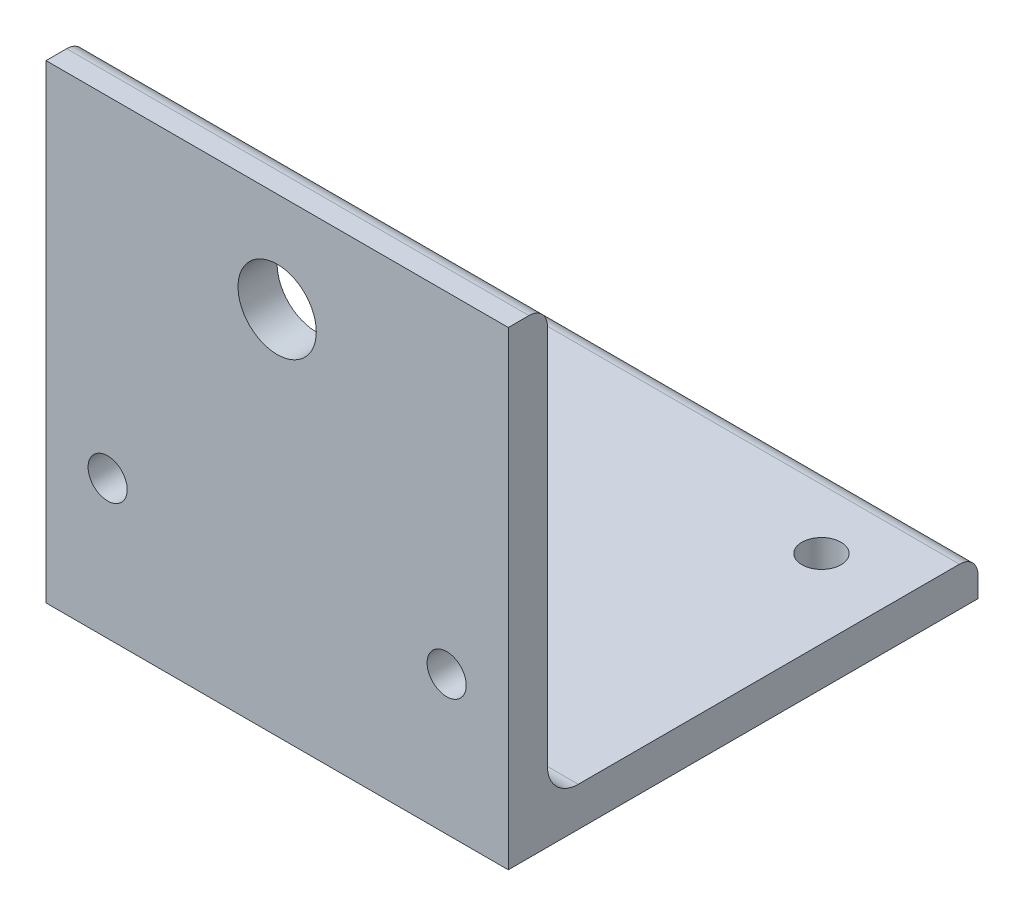
ISO-10303-21;
HEADER;
FILE_DESCRIPTION(('STEP AP214'),'2;1');
FILE_NAME('part.step','',(''),(''),'','','');
FILE_SCHEMA(('AUTOMOTIVE_DESIGN { 1 0 10303 214 1 1 1 1 }'));
ENDSEC;
DATA;
#1=APPLICATION_CONTEXT('core data for automotive mechanical design processes');
#2=APPLICATION_PROTOCOL_DEFINITION('international standard','automotive_design',2000,#1);
#3=PRODUCT_CONTEXT('',#1,'mechanical');
#4=PRODUCT('Part','Part','',(#3));
#5=PRODUCT_RELATED_PRODUCT_CATEGORY('part','',(#4));
#6=PRODUCT_DEFINITION_FORMATION('','',#4);
#7=PRODUCT_DEFINITION_CONTEXT('part definition',#1,'design');
#8=PRODUCT_DEFINITION('design','',#6,#7);
#9=PRODUCT_DEFINITION_SHAPE('','',#8);
#10=(LENGTH_UNIT() NAMED_UNIT(*) SI_UNIT(.MILLI.,.METRE.));
#11=(NAMED_UNIT(*) PLANE_ANGLE_UNIT() SI_UNIT($,.RADIAN.));
#12=(NAMED_UNIT(*) SI_UNIT($,.STERADIAN.) SOLID_ANGLE_UNIT());
#13=UNCERTAINTY_MEASURE_WITH_UNIT(LENGTH_MEASURE(1.E-05),#10,'distance_accuracy_value','');
#14=(GEOMETRIC_REPRESENTATION_CONTEXT(3) GLOBAL_UNCERTAINTY_ASSIGNED_CONTEXT((#13)) GLOBAL_UNIT_ASSIGNED_CONTEXT((#10,
#11,#12)) REPRESENTATION_CONTEXT('',''));
#15=CARTESIAN_POINT('',(0.,0.,0.));
#16=DIRECTION('',(0.,0.,1.));
#17=DIRECTION('',(1.,0.,0.));
#18=AXIS2_PLACEMENT_3D('',#15,#16,#17);
#19=CARTESIAN_POINT('',(75.,0.,-76.2));
#20=DIRECTION('',(0.,1.,0.));
#21=DIRECTION('',(0.,0.,1.));
#22=AXIS2_PLACEMENT_3D('',#19,#20,#21);
#23=PLANE('',#22);
#24=CARTESIAN_POINT('',(62.3,0.,-63.5));
#25=DIRECTION('',(0.,-1.,0.));
#26=DIRECTION('',(0.,0.,-1.));
#27=AXIS2_PLACEMENT_3D('',#24,#25,#26);
#28=CIRCLE('',#27,3.175);
#29=CARTESIAN_POINT('',(62.3,0.,-66.675));
#30=VERTEX_POINT('',#29);
#31=EDGE_CURVE('E174',#30,#30,#28,.T.);
#32=ORIENTED_EDGE('',*,*,#31,.F.);
#33=EDGE_LOOP('',(#32));
#34=FACE_BOUND('',#33,.T.);
#35=CARTESIAN_POINT('',(12.7,0.,-63.5));
#36=DIRECTION('',(0.,-1.,0.));
#37=DIRECTION('',(0.,0.,-1.));
#38=AXIS2_PLACEMENT_3D('',#35,#36,#37);
#39=CIRCLE('',#38,3.175);
#40=CARTESIAN_POINT('',(12.7,0.,-66.675));
#41=VERTEX_POINT('',#40);
#42=EDGE_CURVE('E163',#41,#41,#39,.T.);
#43=ORIENTED_EDGE('',*,*,#42,.F.);
#44=EDGE_LOOP('',(#43));
#45=FACE_BOUND('',#44,.T.);
#46=DIRECTION('',(0.,0.,-1.));
#47=VECTOR('',#46,1.);
#48=CARTESIAN_POINT('',(0.,0.,-76.2));
#49=LINE('',#48,#47);
#50=CARTESIAN_POINT('',(0.,0.,0.));
#51=VERTEX_POINT('',#50);
#52=CARTESIAN_POINT('',(0.,0.,-76.2));
#53=VERTEX_POINT('',#52);
#54=EDGE_CURVE('E129',#51,#53,#49,.T.);
#55=ORIENTED_EDGE('',*,*,#54,.T.);
#56=DIRECTION('',(-1.,0.,0.));
#57=VECTOR('',#56,1.);
#58=CARTESIAN_POINT('',(75.,0.,-76.2));
#59=LINE('',#58,#57);
#60=CARTESIAN_POINT('',(75.,0.,-76.2));
#61=VERTEX_POINT('',#60);
#62=EDGE_CURVE('E110',#61,#53,#59,.T.);
#63=ORIENTED_EDGE('',*,*,#62,.F.);
#64=DIRECTION('',(0.,0.,-1.));
#65=VECTOR('',#64,1.);
#66=CARTESIAN_POINT('',(75.,0.,-76.2));
#67=LINE('',#66,#65);
#68=CARTESIAN_POINT('',(75.,0.,0.));
#69=VERTEX_POINT('',#68);
#70=EDGE_CURVE('E117',#69,#61,#67,.T.);
#71=ORIENTED_EDGE('',*,*,#70,.F.);
#72=DIRECTION('',(-1.,0.,0.));
#73=VECTOR('',#72,1.);
#74=CARTESIAN_POINT('',(75.,0.,0.));
#75=LINE('',#74,#73);
#76=EDGE_CURVE('E137',#69,#51,#75,.T.);
#77=ORIENTED_EDGE('',*,*,#76,.T.);
#78=EDGE_LOOP('',(#55,#63,#71,#77));
#79=FACE_BOUND('',#78,.T.);
#80=ADVANCED_FACE('F32',(#34,#45,#79),#23,.F.);
#81=CARTESIAN_POINT('',(75.,6.35,-76.2));
#82=DIRECTION('',(0.,0.,1.));
#83=DIRECTION('',(1.,0.,0.));
#84=AXIS2_PLACEMENT_3D('',#81,#82,#83);
#85=PLANE('',#84);
#86=DIRECTION('',(0.,1.,0.));
#87=VECTOR('',#86,1.);
#88=CARTESIAN_POINT('',(0.,6.35,-76.2));
#89=LINE('',#88,#87);
#90=CARTESIAN_POINT('',(0.,3.35,-76.2));
#91=VERTEX_POINT('',#90);
#92=EDGE_CURVE('E198',#53,#91,#89,.T.);
#93=ORIENTED_EDGE('',*,*,#92,.T.);
#94=DIRECTION('',(-1.,0.,0.));
#95=VECTOR('',#94,1.);
#96=CARTESIAN_POINT('',(75.,3.35,-76.2));
#97=LINE('',#96,#95);
#98=CARTESIAN_POINT('',(75.,3.35,-76.2));
#99=VERTEX_POINT('',#98);
#100=EDGE_CURVE('E113',#91,#99,#97,.F.);
#101=ORIENTED_EDGE('',*,*,#100,.T.);
#102=DIRECTION('',(0.,1.,0.));
#103=VECTOR('',#102,1.);
#104=CARTESIAN_POINT('',(75.,6.35,-76.2));
#105=LINE('',#104,#103);
#106=EDGE_CURVE('E105',#61,#99,#105,.T.);
#107=ORIENTED_EDGE('',*,*,#106,.F.);
#108=ORIENTED_EDGE('',*,*,#62,.T.);
#109=EDGE_LOOP('',(#93,#101,#107,#108));
#110=FACE_BOUND('',#109,.T.);
#111=ADVANCED_FACE('F108',(#110),#85,.F.);
#112=CARTESIAN_POINT('',(75.,6.34999999999999,-6.35));
#113=DIRECTION('',(0.,-1.,0.));
#114=DIRECTION('',(0.,0.,-1.));
#115=AXIS2_PLACEMENT_3D('',#112,#113,#114);
#116=PLANE('',#115);
#117=CARTESIAN_POINT('',(62.3,6.34999999999999,-63.5));
#118=DIRECTION('',(0.,-1.,0.));
#119=DIRECTION('',(0.,0.,-1.));
#120=AXIS2_PLACEMENT_3D('',#117,#118,#119);
#121=CIRCLE('',#120,3.175);
#122=CARTESIAN_POINT('',(62.3,6.34999999999999,-66.675));
#123=VERTEX_POINT('',#122);
#124=EDGE_CURVE('E36',#123,#123,#121,.T.);
#125=ORIENTED_EDGE('',*,*,#124,.T.);
#126=EDGE_LOOP('',(#125));
#127=FACE_BOUND('',#126,.T.);
#128=CARTESIAN_POINT('',(12.7,6.34999999999999,-63.5));
#129=DIRECTION('',(0.,-1.,0.));
#130=DIRECTION('',(0.,0.,-1.));
#131=AXIS2_PLACEMENT_3D('',#128,#129,#130);
#132=CIRCLE('',#131,3.175);
#133=CARTESIAN_POINT('',(12.7,6.34999999999999,-66.675));
#134=VERTEX_POINT('',#133);
#135=EDGE_CURVE('E160',#134,#134,#132,.T.);
#136=ORIENTED_EDGE('',*,*,#135,.T.);
#137=EDGE_LOOP('',(#136));
#138=FACE_BOUND('',#137,.T.);
#139=DIRECTION('',(0.,0.,1.));
#140=VECTOR('',#139,1.);
#141=CARTESIAN_POINT('',(0.,6.34999999999999,-6.35));
#142=LINE('',#141,#140);
#143=CARTESIAN_POINT('',(0.,6.35,-73.2));
#144=VERTEX_POINT('',#143);
#145=CARTESIAN_POINT('',(0.,6.34999999999999,-11.35));
#146=VERTEX_POINT('',#145);
#147=EDGE_CURVE('E200',#144,#146,#142,.T.);
#148=ORIENTED_EDGE('',*,*,#147,.T.);
#149=DIRECTION('',(-1.,0.,0.));
#150=VECTOR('',#149,1.);
#151=CARTESIAN_POINT('',(75.,6.34999999999999,-11.35));
#152=LINE('',#151,#150);
#153=CARTESIAN_POINT('',(75.,6.34999999999999,-11.35));
#154=VERTEX_POINT('',#153);
#155=EDGE_CURVE('E55',#146,#154,#152,.F.);
#156=ORIENTED_EDGE('',*,*,#155,.T.);
#157=DIRECTION('',(0.,0.,1.));
#158=VECTOR('',#157,1.);
#159=CARTESIAN_POINT('',(75.,6.34999999999999,-6.35));
#160=LINE('',#159,#158);
#161=CARTESIAN_POINT('',(75.,6.35,-73.2));
#162=VERTEX_POINT('',#161);
#163=EDGE_CURVE('E116',#162,#154,#160,.T.);
#164=ORIENTED_EDGE('',*,*,#163,.F.);
#165=DIRECTION('',(-1.,0.,0.));
#166=VECTOR('',#165,1.);
#167=CARTESIAN_POINT('',(75.,6.35,-73.2));
#168=LINE('',#167,#166);
#169=EDGE_CURVE('E130',#162,#144,#168,.T.);
#170=ORIENTED_EDGE('',*,*,#169,.T.);
#171=EDGE_LOOP('',(#148,#156,#164,#170));
#172=FACE_BOUND('',#171,.T.);
#173=ADVANCED_FACE('F214',(#127,#138,#172),#116,.F.);
#174=CARTESIAN_POINT('',(75.,76.2,-6.35));
#175=DIRECTION('',(0.,0.,1.));
#176=DIRECTION('',(0.,-1.,0.));
#177=AXIS2_PLACEMENT_3D('',#174,#175,#176);
#178=PLANE('',#177);
#179=CARTESIAN_POINT('',(65.,22.5,-6.35000000000001));
#180=DIRECTION('',(0.,0.,1.));
#181=DIRECTION('',(0.,-1.,0.));
#182=AXIS2_PLACEMENT_3D('',#179,#180,#181);
#183=CIRCLE('',#182,3.175);
#184=CARTESIAN_POINT('',(68.175,22.5,-6.35000000000002));
#185=VERTEX_POINT('',#184);
#186=EDGE_CURVE('E167',#185,#185,#183,.T.);
#187=ORIENTED_EDGE('',*,*,#186,.T.);
#188=EDGE_LOOP('',(#187));
#189=FACE_BOUND('',#188,.T.);
#190=CARTESIAN_POINT('',(9.99999999999999,22.5,-6.35000000000001));
#191=DIRECTION('',(0.,0.,1.));
#192=DIRECTION('',(0.,-1.,0.));
#193=AXIS2_PLACEMENT_3D('',#190,#191,#192);
#194=CIRCLE('',#193,3.175);
#195=CARTESIAN_POINT('',(13.175,22.5,-6.35000000000002));
#196=VERTEX_POINT('',#195);
#197=EDGE_CURVE('E182',#196,#196,#194,.T.);
#198=ORIENTED_EDGE('',*,*,#197,.T.);
#199=EDGE_LOOP('',(#198));
#200=FACE_BOUND('',#199,.T.);
#201=CARTESIAN_POINT('',(37.5,60.,-6.35000000000001));
#202=DIRECTION('',(0.,0.,1.));
#203=DIRECTION('',(0.,-1.,0.));
#204=AXIS2_PLACEMENT_3D('',#201,#202,#203);
#205=CIRCLE('',#204,6.35);
#206=CARTESIAN_POINT('',(43.85,60.,-6.35000000000002));
#207=VERTEX_POINT('',#206);
#208=EDGE_CURVE('E188',#207,#207,#205,.F.);
#209=ORIENTED_EDGE('',*,*,#208,.F.);
#210=EDGE_LOOP('',(#209));
#211=FACE_BOUND('',#210,.T.);
#212=DIRECTION('',(0.,1.,0.));
#213=VECTOR('',#212,1.);
#214=CARTESIAN_POINT('',(75.,76.2,-6.35));
#215=LINE('',#214,#213);
#216=CARTESIAN_POINT('',(75.,11.35,-6.35));
#217=VERTEX_POINT('',#216);
#218=CARTESIAN_POINT('',(75.,73.2,-6.35));
#219=VERTEX_POINT('',#218);
#220=EDGE_CURVE('E192',#217,#219,#215,.T.);
#221=ORIENTED_EDGE('',*,*,#220,.F.);
#222=DIRECTION('',(-1.,0.,0.));
#223=VECTOR('',#222,1.);
#224=CARTESIAN_POINT('',(0.,11.35,-6.35));
#225=LINE('',#224,#223);
#226=CARTESIAN_POINT('',(0.,11.35,-6.35));
#227=VERTEX_POINT('',#226);
#228=EDGE_CURVE('E156',#217,#227,#225,.T.);
#229=ORIENTED_EDGE('',*,*,#228,.T.);
#230=DIRECTION('',(0.,1.,0.));
#231=VECTOR('',#230,1.);
#232=CARTESIAN_POINT('',(0.,76.2,-6.35));
#233=LINE('',#232,#231);
#234=CARTESIAN_POINT('',(0.,73.2,-6.35));
#235=VERTEX_POINT('',#234);
#236=EDGE_CURVE('E202',#227,#235,#233,.T.);
#237=ORIENTED_EDGE('',*,*,#236,.T.);
#238=DIRECTION('',(-1.,0.,0.));
#239=VECTOR('',#238,1.);
#240=CARTESIAN_POINT('',(75.,73.2,-6.35));
#241=LINE('',#240,#239);
#242=EDGE_CURVE('E153',#235,#219,#241,.F.);
#243=ORIENTED_EDGE('',*,*,#242,.T.);
#244=EDGE_LOOP('',(#221,#229,#237,#243));
#245=FACE_BOUND('',#244,.T.);
#246=ADVANCED_FACE('F219',(#189,#200,#211,#245),#178,.F.);
#247=CARTESIAN_POINT('',(75.,76.2,0.));
#248=DIRECTION('',(0.,-1.,0.));
#249=DIRECTION('',(0.,0.,-1.));
#250=AXIS2_PLACEMENT_3D('',#247,#248,#249);
#251=PLANE('',#250);
#252=DIRECTION('',(0.,0.,1.));
#253=VECTOR('',#252,1.);
#254=CARTESIAN_POINT('',(75.,76.2,0.));
#255=LINE('',#254,#253);
#256=CARTESIAN_POINT('',(75.,76.2,-3.35));
#257=VERTEX_POINT('',#256);
#258=CARTESIAN_POINT('',(75.,76.2,0.));
#259=VERTEX_POINT('',#258);
#260=EDGE_CURVE('E194',#257,#259,#255,.T.);
#261=ORIENTED_EDGE('',*,*,#260,.F.);
#262=DIRECTION('',(-1.,0.,0.));
#263=VECTOR('',#262,1.);
#264=CARTESIAN_POINT('',(75.,76.2,-3.35));
#265=LINE('',#264,#263);
#266=CARTESIAN_POINT('',(0.,76.2,-3.35));
#267=VERTEX_POINT('',#266);
#268=EDGE_CURVE('E150',#257,#267,#265,.T.);
#269=ORIENTED_EDGE('',*,*,#268,.T.);
#270=DIRECTION('',(0.,0.,1.));
#271=VECTOR('',#270,1.);
#272=CARTESIAN_POINT('',(0.,76.2,0.));
#273=LINE('',#272,#271);
#274=CARTESIAN_POINT('',(0.,76.2,0.));
#275=VERTEX_POINT('',#274);
#276=EDGE_CURVE('E204',#267,#275,#273,.T.);
#277=ORIENTED_EDGE('',*,*,#276,.T.);
#278=DIRECTION('',(-1.,0.,0.));
#279=VECTOR('',#278,1.);
#280=CARTESIAN_POINT('',(75.,76.2,0.));
#281=LINE('',#280,#279);
#282=EDGE_CURVE('E131',#259,#275,#281,.T.);
#283=ORIENTED_EDGE('',*,*,#282,.F.);
#284=EDGE_LOOP('',(#261,#269,#277,#283));
#285=FACE_BOUND('',#284,.T.);
#286=ADVANCED_FACE('F228',(#285),#251,.F.);
#287=CARTESIAN_POINT('',(75.,0.,0.));
#288=DIRECTION('',(0.,0.,-1.));
#289=DIRECTION('',(-1.,0.,0.));
#290=AXIS2_PLACEMENT_3D('',#287,#288,#289);
#291=PLANE('',#290);
#292=CARTESIAN_POINT('',(65.,22.5,0.));
#293=DIRECTION('',(0.,0.,1.));
#294=DIRECTION('',(1.,0.,0.));
#295=AXIS2_PLACEMENT_3D('',#292,#293,#294);
#296=CIRCLE('',#295,3.175);
#297=CARTESIAN_POINT('',(68.175,22.5,0.));
#298=VERTEX_POINT('',#297);
#299=EDGE_CURVE('E162',#298,#298,#296,.T.);
#300=ORIENTED_EDGE('',*,*,#299,.F.);
#301=EDGE_LOOP('',(#300));
#302=FACE_BOUND('',#301,.T.);
#303=CARTESIAN_POINT('',(9.99999999999999,22.5,0.));
#304=DIRECTION('',(0.,0.,1.));
#305=DIRECTION('',(1.,0.,0.));
#306=AXIS2_PLACEMENT_3D('',#303,#304,#305);
#307=CIRCLE('',#306,3.175);
#308=CARTESIAN_POINT('',(13.175,22.5,0.));
#309=VERTEX_POINT('',#308);
#310=EDGE_CURVE('E179',#309,#309,#307,.T.);
#311=ORIENTED_EDGE('',*,*,#310,.F.);
#312=EDGE_LOOP('',(#311));
#313=FACE_BOUND('',#312,.T.);
#314=CARTESIAN_POINT('',(37.5,60.,0.));
#315=DIRECTION('',(0.,0.,-1.));
#316=DIRECTION('',(-1.,0.,0.));
#317=AXIS2_PLACEMENT_3D('',#314,#315,#316);
#318=CIRCLE('',#317,6.35);
#319=CARTESIAN_POINT('',(43.85,60.,0.));
#320=VERTEX_POINT('',#319);
#321=EDGE_CURVE('E185',#320,#320,#318,.T.);
#322=ORIENTED_EDGE('',*,*,#321,.T.);
#323=EDGE_LOOP('',(#322));
#324=FACE_BOUND('',#323,.T.);
#325=DIRECTION('',(0.,-1.,0.));
#326=VECTOR('',#325,1.);
#327=CARTESIAN_POINT('',(0.,0.,0.));
#328=LINE('',#327,#326);
#329=EDGE_CURVE('E126',#275,#51,#328,.T.);
#330=ORIENTED_EDGE('',*,*,#329,.T.);
#331=ORIENTED_EDGE('',*,*,#76,.F.);
#332=DIRECTION('',(0.,-1.,0.));
#333=VECTOR('',#332,1.);
#334=CARTESIAN_POINT('',(75.,0.,0.));
#335=LINE('',#334,#333);
#336=EDGE_CURVE('E122',#259,#69,#335,.T.);
#337=ORIENTED_EDGE('',*,*,#336,.F.);
#338=ORIENTED_EDGE('',*,*,#282,.T.);
#339=EDGE_LOOP('',(#330,#331,#337,#338));
#340=FACE_BOUND('',#339,.T.);
#341=ADVANCED_FACE('F229',(#302,#313,#324,#340),#291,.F.);
#342=CARTESIAN_POINT('',(75.,0.,0.));
#343=DIRECTION('',(-1.,0.,0.));
#344=DIRECTION('',(0.,0.,1.));
#345=AXIS2_PLACEMENT_3D('',#342,#343,#344);
#346=PLANE('',#345);
#347=ORIENTED_EDGE('',*,*,#106,.T.);
#348=CARTESIAN_POINT('',(75.,3.35,-73.2));
#349=DIRECTION('',(-1.,0.,0.));
#350=DIRECTION('',(0.,0.,1.));
#351=AXIS2_PLACEMENT_3D('',#348,#349,#350);
#352=CIRCLE('',#351,3.);
#353=EDGE_CURVE('E148',#99,#162,#352,.F.);
#354=ORIENTED_EDGE('',*,*,#353,.T.);
#355=ORIENTED_EDGE('',*,*,#163,.T.);
#356=CARTESIAN_POINT('',(75.,11.35,-11.35));
#357=DIRECTION('',(-1.,0.,0.));
#358=DIRECTION('',(0.,0.,1.));
#359=AXIS2_PLACEMENT_3D('',#356,#357,#358);
#360=CIRCLE('',#359,5.);
#361=EDGE_CURVE('E11',#154,#217,#360,.T.);
#362=ORIENTED_EDGE('',*,*,#361,.T.);
#363=ORIENTED_EDGE('',*,*,#220,.T.);
#364=CARTESIAN_POINT('',(75.,73.2,-3.35));
#365=DIRECTION('',(-1.,0.,0.));
#366=DIRECTION('',(0.,0.,1.));
#367=AXIS2_PLACEMENT_3D('',#364,#365,#366);
#368=CIRCLE('',#367,3.);
#369=EDGE_CURVE('E146',#219,#257,#368,.F.);
#370=ORIENTED_EDGE('',*,*,#369,.T.);
#371=ORIENTED_EDGE('',*,*,#260,.T.);
#372=ORIENTED_EDGE('',*,*,#336,.T.);
#373=ORIENTED_EDGE('',*,*,#70,.T.);
#374=EDGE_LOOP('',(#347,#354,#355,#362,#363,#370,#371,#372,#373));
#375=FACE_BOUND('',#374,.T.);
#376=ADVANCED_FACE('F120',(#375),#346,.F.);
#377=CARTESIAN_POINT('',(0.,0.,0.));
#378=DIRECTION('',(-1.,0.,0.));
#379=DIRECTION('',(0.,0.,1.));
#380=AXIS2_PLACEMENT_3D('',#377,#378,#379);
#381=PLANE('',#380);
#382=ORIENTED_EDGE('',*,*,#147,.F.);
#383=CARTESIAN_POINT('',(0.,3.35,-73.2));
#384=DIRECTION('',(-1.,0.,0.));
#385=DIRECTION('',(0.,0.,1.));
#386=AXIS2_PLACEMENT_3D('',#383,#384,#385);
#387=CIRCLE('',#386,3.);
#388=EDGE_CURVE('E143',#144,#91,#387,.T.);
#389=ORIENTED_EDGE('',*,*,#388,.T.);
#390=ORIENTED_EDGE('',*,*,#92,.F.);
#391=ORIENTED_EDGE('',*,*,#54,.F.);
#392=ORIENTED_EDGE('',*,*,#329,.F.);
#393=ORIENTED_EDGE('',*,*,#276,.F.);
#394=CARTESIAN_POINT('',(0.,73.2,-3.35));
#395=DIRECTION('',(-1.,0.,0.));
#396=DIRECTION('',(0.,0.,1.));
#397=AXIS2_PLACEMENT_3D('',#394,#395,#396);
#398=CIRCLE('',#397,3.);
#399=EDGE_CURVE('E134',#267,#235,#398,.T.);
#400=ORIENTED_EDGE('',*,*,#399,.T.);
#401=ORIENTED_EDGE('',*,*,#236,.F.);
#402=CARTESIAN_POINT('',(0.,11.35,-11.35));
#403=DIRECTION('',(-1.,0.,0.));
#404=DIRECTION('',(0.,0.,1.));
#405=AXIS2_PLACEMENT_3D('',#402,#403,#404);
#406=CIRCLE('',#405,5.);
#407=EDGE_CURVE('E41',#227,#146,#406,.F.);
#408=ORIENTED_EDGE('',*,*,#407,.T.);
#409=EDGE_LOOP('',(#382,#389,#390,#391,#392,#393,#400,#401,#408));
#410=FACE_BOUND('',#409,.T.);
#411=ADVANCED_FACE('F208',(#410),#381,.T.);
#412=CARTESIAN_POINT('',(75.,3.35,-73.2));
#413=DIRECTION('',(-1.,0.,0.));
#414=DIRECTION('',(0.,0.,1.));
#415=AXIS2_PLACEMENT_3D('',#412,#413,#414);
#416=CYLINDRICAL_SURFACE('',#415,3.);
#417=ORIENTED_EDGE('',*,*,#353,.F.);
#418=ORIENTED_EDGE('',*,*,#100,.F.);
#419=ORIENTED_EDGE('',*,*,#388,.F.);
#420=ORIENTED_EDGE('',*,*,#169,.F.);
#421=EDGE_LOOP('',(#417,#418,#419,#420));
#422=FACE_BOUND('',#421,.T.);
#423=ADVANCED_FACE('F211',(#422),#416,.T.);
#424=CARTESIAN_POINT('',(75.,73.2,-3.35));
#425=DIRECTION('',(-1.,0.,0.));
#426=DIRECTION('',(0.,0.,1.));
#427=AXIS2_PLACEMENT_3D('',#424,#425,#426);
#428=CYLINDRICAL_SURFACE('',#427,3.);
#429=ORIENTED_EDGE('',*,*,#369,.F.);
#430=ORIENTED_EDGE('',*,*,#242,.F.);
#431=ORIENTED_EDGE('',*,*,#399,.F.);
#432=ORIENTED_EDGE('',*,*,#268,.F.);
#433=EDGE_LOOP('',(#429,#430,#431,#432));
#434=FACE_BOUND('',#433,.T.);
#435=ADVANCED_FACE('F224',(#434),#428,.T.);
#436=CARTESIAN_POINT('',(75.,11.35,-11.35));
#437=DIRECTION('',(1.,0.,0.));
#438=DIRECTION('',(0.,0.,-1.));
#439=AXIS2_PLACEMENT_3D('',#436,#437,#438);
#440=CYLINDRICAL_SURFACE('',#439,5.);
#441=ORIENTED_EDGE('',*,*,#361,.F.);
#442=ORIENTED_EDGE('',*,*,#155,.F.);
#443=ORIENTED_EDGE('',*,*,#407,.F.);
#444=ORIENTED_EDGE('',*,*,#228,.F.);
#445=EDGE_LOOP('',(#441,#442,#443,#444));
#446=FACE_BOUND('',#445,.T.);
#447=ADVANCED_FACE('F34',(#446),#440,.F.);
#448=CARTESIAN_POINT('',(37.5,60.,-76.2));
#449=DIRECTION('',(0.,0.,1.));
#450=DIRECTION('',(1.,0.,0.));
#451=AXIS2_PLACEMENT_3D('',#448,#449,#450);
#452=CYLINDRICAL_SURFACE('',#451,6.35);
#453=CARTESIAN_POINT('',(43.85,60.,0.));
#454=CARTESIAN_POINT('',(43.85,60.,-0.0661458333333318));
#455=CARTESIAN_POINT('',(43.85,60.,-0.132291666666664));
#456=CARTESIAN_POINT('',(43.85,60.,-0.264583333333332));
#457=CARTESIAN_POINT('',(43.85,60.,-0.330729166666668));
#458=CARTESIAN_POINT('',(43.85,60.,-0.463020833333337));
#459=CARTESIAN_POINT('',(43.85,60.,-0.529166666666669));
#460=CARTESIAN_POINT('',(43.85,60.,-0.661458333333337));
#461=CARTESIAN_POINT('',(43.85,60.,-0.727604166666673));
#462=CARTESIAN_POINT('',(43.85,60.,-0.859895833333342));
#463=CARTESIAN_POINT('',(43.85,60.,-0.926041666666673));
#464=CARTESIAN_POINT('',(43.85,60.,-1.05833333333334));
#465=CARTESIAN_POINT('',(43.85,60.,-1.12447916666667));
#466=CARTESIAN_POINT('',(43.85,60.,-1.25677083333334));
#467=CARTESIAN_POINT('',(43.85,60.,-1.32291666666667));
#468=CARTESIAN_POINT('',(43.85,60.,-1.45520833333334));
#469=CARTESIAN_POINT('',(43.85,60.,-1.52135416666667));
#470=CARTESIAN_POINT('',(43.85,60.,-1.65364583333334));
#471=CARTESIAN_POINT('',(43.85,60.,-1.71979166666667));
#472=CARTESIAN_POINT('',(43.85,60.,-1.85208333333334));
#473=CARTESIAN_POINT('',(43.85,60.,-1.91822916666667));
#474=CARTESIAN_POINT('',(43.85,60.,-2.05052083333334));
#475=CARTESIAN_POINT('',(43.85,60.,-2.11666666666667));
#476=CARTESIAN_POINT('',(43.85,60.,-2.24895833333334));
#477=CARTESIAN_POINT('',(43.85,60.,-2.31510416666667));
#478=CARTESIAN_POINT('',(43.85,60.,-2.44739583333334));
#479=CARTESIAN_POINT('',(43.85,60.,-2.51354166666667));
#480=CARTESIAN_POINT('',(43.85,60.,-2.64583333333334));
#481=CARTESIAN_POINT('',(43.85,60.,-2.71197916666667));
#482=CARTESIAN_POINT('',(43.85,60.,-2.84427083333334));
#483=CARTESIAN_POINT('',(43.85,60.,-2.91041666666668));
#484=CARTESIAN_POINT('',(43.85,60.,-3.04270833333335));
#485=CARTESIAN_POINT('',(43.85,60.,-3.10885416666668));
#486=CARTESIAN_POINT('',(43.85,60.,-3.24114583333334));
#487=CARTESIAN_POINT('',(43.85,60.,-3.30729166666667));
#488=CARTESIAN_POINT('',(43.85,60.,-3.43958333333334));
#489=CARTESIAN_POINT('',(43.85,60.,-3.50572916666668));
#490=CARTESIAN_POINT('',(43.85,60.,-3.63802083333335));
#491=CARTESIAN_POINT('',(43.85,60.,-3.70416666666668));
#492=CARTESIAN_POINT('',(43.85,60.,-3.83645833333335));
#493=CARTESIAN_POINT('',(43.85,60.,-3.90260416666668));
#494=CARTESIAN_POINT('',(43.85,60.,-4.03489583333335));
#495=CARTESIAN_POINT('',(43.85,60.,-4.10104166666668));
#496=CARTESIAN_POINT('',(43.85,60.,-4.23333333333335));
#497=CARTESIAN_POINT('',(43.85,60.,-4.29947916666668));
#498=CARTESIAN_POINT('',(43.85,60.,-4.43177083333335));
#499=CARTESIAN_POINT('',(43.85,60.,-4.49791666666668));
#500=CARTESIAN_POINT('',(43.85,60.,-4.63020833333335));
#501=CARTESIAN_POINT('',(43.85,60.,-4.69635416666668));
#502=CARTESIAN_POINT('',(43.85,60.,-4.82864583333335));
#503=CARTESIAN_POINT('',(43.85,60.,-4.89479166666668));
#504=CARTESIAN_POINT('',(43.85,60.,-5.02708333333335));
#505=CARTESIAN_POINT('',(43.85,60.,-5.09322916666668));
#506=CARTESIAN_POINT('',(43.85,60.,-5.22552083333335));
#507=CARTESIAN_POINT('',(43.85,60.,-5.29166666666668));
#508=CARTESIAN_POINT('',(43.85,60.,-5.42395833333335));
#509=CARTESIAN_POINT('',(43.85,60.,-5.49010416666668));
#510=CARTESIAN_POINT('',(43.85,60.,-5.62239583333335));
#511=CARTESIAN_POINT('',(43.85,60.,-5.68854166666669));
#512=CARTESIAN_POINT('',(43.85,60.,-5.82083333333335));
#513=CARTESIAN_POINT('',(43.85,60.,-5.88697916666669));
#514=CARTESIAN_POINT('',(43.85,60.,-6.01927083333335));
#515=CARTESIAN_POINT('',(43.85,60.,-6.08541666666669));
#516=CARTESIAN_POINT('',(43.85,60.,-6.21770833333336));
#517=CARTESIAN_POINT('',(43.85,60.,-6.28385416666669));
#518=CARTESIAN_POINT('',(43.85,60.,-6.35000000000002));
#519=B_SPLINE_CURVE_WITH_KNOTS('',3,(#453,#454,#455,#456,#457,#458,#459,#460,#461,#462,#463,
#464,#465,#466,#467,#468,#469,#470,#471,#472,#473,#474,#475,#476,#477,#478,#479,#480,#481,#482,
#483,#484,#485,#486,#487,#488,#489,#490,#491,#492,#493,#494,#495,#496,#497,#498,#499,#500,#501,
#502,#503,#504,#505,#506,#507,#508,#509,#510,#511,#512,#513,#514,#515,#516,#517,#518),
.UNSPECIFIED.,.F.,.F.,(4,2,2,2,2,2,2,2,2,2,2,2,2,2,2,2,2,2,2,2,2,2,2,2,2,2,2,2,2,2,2,2,4),(0.,
0.198437499999995,0.396875000000005,0.5953125,0.79375000000001,0.992187500000005,1.190625,
1.38906250000001,1.58750000000001,1.7859375,1.98437500000001,2.18281250000001,2.38125,
2.57968750000001,2.77812500000001,2.97656250000002,3.17500000000001,3.37343750000001,
3.57187500000002,3.77031250000001,3.96875000000002,4.16718750000002,4.36562500000001,
4.56406250000002,4.76250000000002,4.96093750000001,5.15937500000002,5.35781250000002,
5.55625000000001,5.75468750000002,5.95312500000002,6.15156250000003,6.35000000000002),.UNSPECIFIED.);
#520=EDGE_CURVE('BSEAM258',#320,#207,#519,.T.);
#521=ORIENTED_EDGE('',*,*,#321,.F.);
#522=ORIENTED_EDGE('',*,*,#208,.T.);
#523=ORIENTED_EDGE('',*,*,#520,.T.);
#524=ORIENTED_EDGE('',*,*,#520,.F.);
#525=EDGE_LOOP('',(#521,#523,#522,#524));
#526=FACE_BOUND('',#525,.T.);
#527=ADVANCED_FACE('F258',(#526),#452,.F.);
#528=CARTESIAN_POINT('',(9.99999999999999,22.5,-76.2));
#529=DIRECTION('',(0.,0.,1.));
#530=DIRECTION('',(1.,0.,0.));
#531=AXIS2_PLACEMENT_3D('',#528,#529,#530);
#532=CYLINDRICAL_SURFACE('',#531,3.175);
#533=CARTESIAN_POINT('',(13.175,22.5,0.));
#534=CARTESIAN_POINT('',(13.175,22.5,-0.0661458333333318));
#535=CARTESIAN_POINT('',(13.175,22.5,-0.132291666666664));
#536=CARTESIAN_POINT('',(13.175,22.5,-0.264583333333332));
#537=CARTESIAN_POINT('',(13.175,22.5,-0.330729166666668));
#538=CARTESIAN_POINT('',(13.175,22.5,-0.463020833333337));
#539=CARTESIAN_POINT('',(13.175,22.5,-0.529166666666669));
#540=CARTESIAN_POINT('',(13.175,22.5,-0.661458333333337));
#541=CARTESIAN_POINT('',(13.175,22.5,-0.727604166666673));
#542=CARTESIAN_POINT('',(13.175,22.5,-0.859895833333342));
#543=CARTESIAN_POINT('',(13.175,22.5,-0.926041666666673));
#544=CARTESIAN_POINT('',(13.175,22.5,-1.05833333333334));
#545=CARTESIAN_POINT('',(13.175,22.5,-1.12447916666667));
#546=CARTESIAN_POINT('',(13.175,22.5,-1.25677083333334));
#547=CARTESIAN_POINT('',(13.175,22.5,-1.32291666666667));
#548=CARTESIAN_POINT('',(13.175,22.5,-1.45520833333334));
#549=CARTESIAN_POINT('',(13.175,22.5,-1.52135416666667));
#550=CARTESIAN_POINT('',(13.175,22.5,-1.65364583333334));
#551=CARTESIAN_POINT('',(13.175,22.5,-1.71979166666667));
#552=CARTESIAN_POINT('',(13.175,22.5,-1.85208333333334));
#553=CARTESIAN_POINT('',(13.175,22.5,-1.91822916666667));
#554=CARTESIAN_POINT('',(13.175,22.5,-2.05052083333334));
#555=CARTESIAN_POINT('',(13.175,22.5,-2.11666666666667));
#556=CARTESIAN_POINT('',(13.175,22.5,-2.24895833333334));
#557=CARTESIAN_POINT('',(13.175,22.5,-2.31510416666667));
#558=CARTESIAN_POINT('',(13.175,22.5,-2.44739583333334));
#559=CARTESIAN_POINT('',(13.175,22.5,-2.51354166666667));
#560=CARTESIAN_POINT('',(13.175,22.5,-2.64583333333334));
#561=CARTESIAN_POINT('',(13.175,22.5,-2.71197916666667));
#562=CARTESIAN_POINT('',(13.175,22.5,-2.84427083333334));
#563=CARTESIAN_POINT('',(13.175,22.5,-2.91041666666668));
#564=CARTESIAN_POINT('',(13.175,22.5,-3.04270833333335));
#565=CARTESIAN_POINT('',(13.175,22.5,-3.10885416666668));
#566=CARTESIAN_POINT('',(13.175,22.5,-3.24114583333334));
#567=CARTESIAN_POINT('',(13.175,22.5,-3.30729166666667));
#568=CARTESIAN_POINT('',(13.175,22.5,-3.43958333333334));
#569=CARTESIAN_POINT('',(13.175,22.5,-3.50572916666668));
#570=CARTESIAN_POINT('',(13.175,22.5,-3.63802083333335));
#571=CARTESIAN_POINT('',(13.175,22.5,-3.70416666666668));
#572=CARTESIAN_POINT('',(13.175,22.5,-3.83645833333335));
#573=CARTESIAN_POINT('',(13.175,22.5,-3.90260416666668));
#574=CARTESIAN_POINT('',(13.175,22.5,-4.03489583333335));
#575=CARTESIAN_POINT('',(13.175,22.5,-4.10104166666668));
#576=CARTESIAN_POINT('',(13.175,22.5,-4.23333333333335));
#577=CARTESIAN_POINT('',(13.175,22.5,-4.29947916666668));
#578=CARTESIAN_POINT('',(13.175,22.5,-4.43177083333335));
#579=CARTESIAN_POINT('',(13.175,22.5,-4.49791666666668));
#580=CARTESIAN_POINT('',(13.175,22.5,-4.63020833333335));
#581=CARTESIAN_POINT('',(13.175,22.5,-4.69635416666668));
#582=CARTESIAN_POINT('',(13.175,22.5,-4.82864583333335));
#583=CARTESIAN_POINT('',(13.175,22.5,-4.89479166666668));
#584=CARTESIAN_POINT('',(13.175,22.5,-5.02708333333335));
#585=CARTESIAN_POINT('',(13.175,22.5,-5.09322916666668));
#586=CARTESIAN_POINT('',(13.175,22.5,-5.22552083333335));
#587=CARTESIAN_POINT('',(13.175,22.5,-5.29166666666668));
#588=CARTESIAN_POINT('',(13.175,22.5,-5.42395833333335));
#589=CARTESIAN_POINT('',(13.175,22.5,-5.49010416666668));
#590=CARTESIAN_POINT('',(13.175,22.5,-5.62239583333335));
#591=CARTESIAN_POINT('',(13.175,22.5,-5.68854166666669));
#592=CARTESIAN_POINT('',(13.175,22.5,-5.82083333333335));
#593=CARTESIAN_POINT('',(13.175,22.5,-5.88697916666669));
#594=CARTESIAN_POINT('',(13.175,22.5,-6.01927083333335));
#595=CARTESIAN_POINT('',(13.175,22.5,-6.08541666666669));
#596=CARTESIAN_POINT('',(13.175,22.5,-6.21770833333336));
#597=CARTESIAN_POINT('',(13.175,22.5,-6.28385416666669));
#598=CARTESIAN_POINT('',(13.175,22.5,-6.35000000000002));
#599=B_SPLINE_CURVE_WITH_KNOTS('',3,(#533,#534,#535,#536,#537,#538,#539,#540,#541,#542,#543,
#544,#545,#546,#547,#548,#549,#550,#551,#552,#553,#554,#555,#556,#557,#558,#559,#560,#561,#562,
#563,#564,#565,#566,#567,#568,#569,#570,#571,#572,#573,#574,#575,#576,#577,#578,#579,#580,#581,
#582,#583,#584,#585,#586,#587,#588,#589,#590,#591,#592,#593,#594,#595,#596,#597,#598),
.UNSPECIFIED.,.F.,.F.,(4,2,2,2,2,2,2,2,2,2,2,2,2,2,2,2,2,2,2,2,2,2,2,2,2,2,2,2,2,2,2,2,4),(0.,
0.198437499999995,0.396875000000005,0.5953125,0.79375000000001,0.992187500000005,1.190625,
1.38906250000001,1.58750000000001,1.7859375,1.98437500000001,2.18281250000001,2.38125,
2.57968750000001,2.77812500000001,2.97656250000002,3.17500000000001,3.37343750000001,
3.57187500000002,3.77031250000001,3.96875000000002,4.16718750000002,4.36562500000001,
4.56406250000002,4.76250000000002,4.96093750000001,5.15937500000002,5.35781250000002,
5.55625000000001,5.75468750000002,5.95312500000002,6.15156250000003,6.35000000000002),.UNSPECIFIED.);
#600=EDGE_CURVE('BSEAM262',#309,#196,#599,.T.);
#601=ORIENTED_EDGE('',*,*,#310,.T.);
#602=ORIENTED_EDGE('',*,*,#197,.F.);
#603=ORIENTED_EDGE('',*,*,#600,.T.);
#604=ORIENTED_EDGE('',*,*,#600,.F.);
#605=EDGE_LOOP('',(#601,#603,#602,#604));
#606=FACE_BOUND('',#605,.T.);
#607=ADVANCED_FACE('F262',(#606),#532,.F.);
#608=CARTESIAN_POINT('',(65.,22.5,-76.2));
#609=DIRECTION('',(0.,0.,1.));
#610=DIRECTION('',(1.,0.,0.));
#611=AXIS2_PLACEMENT_3D('',#608,#609,#610);
#612=CYLINDRICAL_SURFACE('',#611,3.175);
#613=CARTESIAN_POINT('',(68.175,22.5,0.));
#614=CARTESIAN_POINT('',(68.175,22.5,-0.0661458333333318));
#615=CARTESIAN_POINT('',(68.175,22.5,-0.132291666666664));
#616=CARTESIAN_POINT('',(68.175,22.5,-0.264583333333332));
#617=CARTESIAN_POINT('',(68.175,22.5,-0.330729166666668));
#618=CARTESIAN_POINT('',(68.175,22.5,-0.463020833333337));
#619=CARTESIAN_POINT('',(68.175,22.5,-0.529166666666669));
#620=CARTESIAN_POINT('',(68.175,22.5,-0.661458333333337));
#621=CARTESIAN_POINT('',(68.175,22.5,-0.727604166666673));
#622=CARTESIAN_POINT('',(68.175,22.5,-0.859895833333342));
#623=CARTESIAN_POINT('',(68.175,22.5,-0.926041666666673));
#624=CARTESIAN_POINT('',(68.175,22.5,-1.05833333333334));
#625=CARTESIAN_POINT('',(68.175,22.5,-1.12447916666667));
#626=CARTESIAN_POINT('',(68.175,22.5,-1.25677083333334));
#627=CARTESIAN_POINT('',(68.175,22.5,-1.32291666666667));
#628=CARTESIAN_POINT('',(68.175,22.5,-1.45520833333334));
#629=CARTESIAN_POINT('',(68.175,22.5,-1.52135416666667));
#630=CARTESIAN_POINT('',(68.175,22.5,-1.65364583333334));
#631=CARTESIAN_POINT('',(68.175,22.5,-1.71979166666667));
#632=CARTESIAN_POINT('',(68.175,22.5,-1.85208333333334));
#633=CARTESIAN_POINT('',(68.175,22.5,-1.91822916666667));
#634=CARTESIAN_POINT('',(68.175,22.5,-2.05052083333334));
#635=CARTESIAN_POINT('',(68.175,22.5,-2.11666666666667));
#636=CARTESIAN_POINT('',(68.175,22.5,-2.24895833333334));
#637=CARTESIAN_POINT('',(68.175,22.5,-2.31510416666667));
#638=CARTESIAN_POINT('',(68.175,22.5,-2.44739583333334));
#639=CARTESIAN_POINT('',(68.175,22.5,-2.51354166666667));
#640=CARTESIAN_POINT('',(68.175,22.5,-2.64583333333334));
#641=CARTESIAN_POINT('',(68.175,22.5,-2.71197916666667));
#642=CARTESIAN_POINT('',(68.175,22.5,-2.84427083333334));
#643=CARTESIAN_POINT('',(68.175,22.5,-2.91041666666668));
#644=CARTESIAN_POINT('',(68.175,22.5,-3.04270833333335));
#645=CARTESIAN_POINT('',(68.175,22.5,-3.10885416666668));
#646=CARTESIAN_POINT('',(68.175,22.5,-3.24114583333334));
#647=CARTESIAN_POINT('',(68.175,22.5,-3.30729166666667));
#648=CARTESIAN_POINT('',(68.175,22.5,-3.43958333333334));
#649=CARTESIAN_POINT('',(68.175,22.5,-3.50572916666668));
#650=CARTESIAN_POINT('',(68.175,22.5,-3.63802083333335));
#651=CARTESIAN_POINT('',(68.175,22.5,-3.70416666666668));
#652=CARTESIAN_POINT('',(68.175,22.5,-3.83645833333335));
#653=CARTESIAN_POINT('',(68.175,22.5,-3.90260416666668));
#654=CARTESIAN_POINT('',(68.175,22.5,-4.03489583333335));
#655=CARTESIAN_POINT('',(68.175,22.5,-4.10104166666668));
#656=CARTESIAN_POINT('',(68.175,22.5,-4.23333333333335));
#657=CARTESIAN_POINT('',(68.175,22.5,-4.29947916666668));
#658=CARTESIAN_POINT('',(68.175,22.5,-4.43177083333335));
#659=CARTESIAN_POINT('',(68.175,22.5,-4.49791666666668));
#660=CARTESIAN_POINT('',(68.175,22.5,-4.63020833333335));
#661=CARTESIAN_POINT('',(68.175,22.5,-4.69635416666668));
#662=CARTESIAN_POINT('',(68.175,22.5,-4.82864583333335));
#663=CARTESIAN_POINT('',(68.175,22.5,-4.89479166666668));
#664=CARTESIAN_POINT('',(68.175,22.5,-5.02708333333335));
#665=CARTESIAN_POINT('',(68.175,22.5,-5.09322916666668));
#666=CARTESIAN_POINT('',(68.175,22.5,-5.22552083333335));
#667=CARTESIAN_POINT('',(68.175,22.5,-5.29166666666668));
#668=CARTESIAN_POINT('',(68.175,22.5,-5.42395833333335));
#669=CARTESIAN_POINT('',(68.175,22.5,-5.49010416666668));
#670=CARTESIAN_POINT('',(68.175,22.5,-5.62239583333335));
#671=CARTESIAN_POINT('',(68.175,22.5,-5.68854166666669));
#672=CARTESIAN_POINT('',(68.175,22.5,-5.82083333333335));
#673=CARTESIAN_POINT('',(68.175,22.5,-5.88697916666669));
#674=CARTESIAN_POINT('',(68.175,22.5,-6.01927083333335));
#675=CARTESIAN_POINT('',(68.175,22.5,-6.08541666666669));
#676=CARTESIAN_POINT('',(68.175,22.5,-6.21770833333336));
#677=CARTESIAN_POINT('',(68.175,22.5,-6.28385416666669));
#678=CARTESIAN_POINT('',(68.175,22.5,-6.35000000000002));
#679=B_SPLINE_CURVE_WITH_KNOTS('',3,(#613,#614,#615,#616,#617,#618,#619,#620,#621,#622,#623,
#624,#625,#626,#627,#628,#629,#630,#631,#632,#633,#634,#635,#636,#637,#638,#639,#640,#641,#642,
#643,#644,#645,#646,#647,#648,#649,#650,#651,#652,#653,#654,#655,#656,#657,#658,#659,#660,#661,
#662,#663,#664,#665,#666,#667,#668,#669,#670,#671,#672,#673,#674,#675,#676,#677,#678),
.UNSPECIFIED.,.F.,.F.,(4,2,2,2,2,2,2,2,2,2,2,2,2,2,2,2,2,2,2,2,2,2,2,2,2,2,2,2,2,2,2,2,4),(0.,
0.198437499999995,0.396875000000005,0.5953125,0.79375000000001,0.992187500000005,1.190625,
1.38906250000001,1.58750000000001,1.7859375,1.98437500000001,2.18281250000001,2.38125,
2.57968750000001,2.77812500000001,2.97656250000002,3.17500000000001,3.37343750000001,
3.57187500000002,3.77031250000001,3.96875000000002,4.16718750000002,4.36562500000001,
4.56406250000002,4.76250000000002,4.96093750000001,5.15937500000002,5.35781250000002,
5.55625000000001,5.75468750000002,5.95312500000002,6.15156250000003,6.35000000000002),.UNSPECIFIED.);
#680=EDGE_CURVE('BSEAM268',#298,#185,#679,.T.);
#681=ORIENTED_EDGE('',*,*,#299,.T.);
#682=ORIENTED_EDGE('',*,*,#186,.F.);
#683=ORIENTED_EDGE('',*,*,#680,.T.);
#684=ORIENTED_EDGE('',*,*,#680,.F.);
#685=EDGE_LOOP('',(#681,#683,#682,#684));
#686=FACE_BOUND('',#685,.T.);
#687=ADVANCED_FACE('F268',(#686),#612,.F.);
#688=CARTESIAN_POINT('',(12.7,76.2,-63.5));
#689=DIRECTION('',(0.,-1.,0.));
#690=DIRECTION('',(0.,0.,-1.));
#691=AXIS2_PLACEMENT_3D('',#688,#689,#690);
#692=CYLINDRICAL_SURFACE('',#691,3.175);
#693=CARTESIAN_POINT('',(12.7,0.,-66.675));
#694=CARTESIAN_POINT('',(12.7,0.0661458333333318,-66.675));
#695=CARTESIAN_POINT('',(12.7,0.132291666666664,-66.675));
#696=CARTESIAN_POINT('',(12.7,0.264583333333332,-66.675));
#697=CARTESIAN_POINT('',(12.7,0.330729166666668,-66.675));
#698=CARTESIAN_POINT('',(12.7,0.463020833333337,-66.675));
#699=CARTESIAN_POINT('',(12.7,0.529166666666669,-66.675));
#700=CARTESIAN_POINT('',(12.7,0.661458333333332,-66.675));
#701=CARTESIAN_POINT('',(12.7,0.727604166666664,-66.675));
#702=CARTESIAN_POINT('',(12.7,0.859895833333332,-66.675));
#703=CARTESIAN_POINT('',(12.7,0.926041666666669,-66.675));
#704=CARTESIAN_POINT('',(12.7,1.05833333333334,-66.675));
#705=CARTESIAN_POINT('',(12.7,1.12447916666667,-66.675));
#706=CARTESIAN_POINT('',(12.7,1.25677083333333,-66.675));
#707=CARTESIAN_POINT('',(12.7,1.32291666666666,-66.675));
#708=CARTESIAN_POINT('',(12.7,1.45520833333333,-66.675));
#709=CARTESIAN_POINT('',(12.7,1.52135416666666,-66.675));
#710=CARTESIAN_POINT('',(12.7,1.65364583333333,-66.675));
#711=CARTESIAN_POINT('',(12.7,1.71979166666666,-66.675));
#712=CARTESIAN_POINT('',(12.7,1.85208333333333,-66.675));
#713=CARTESIAN_POINT('',(12.7,1.91822916666666,-66.675));
#714=CARTESIAN_POINT('',(12.7,2.05052083333333,-66.675));
#715=CARTESIAN_POINT('',(12.7,2.11666666666666,-66.675));
#716=CARTESIAN_POINT('',(12.7,2.24895833333333,-66.675));
#717=CARTESIAN_POINT('',(12.7,2.31510416666667,-66.675));
#718=CARTESIAN_POINT('',(12.7,2.44739583333333,-66.675));
#719=CARTESIAN_POINT('',(12.7,2.51354166666667,-66.675));
#720=CARTESIAN_POINT('',(12.7,2.64583333333333,-66.675));
#721=CARTESIAN_POINT('',(12.7,2.71197916666666,-66.675));
#722=CARTESIAN_POINT('',(12.7,2.84427083333333,-66.675));
#723=CARTESIAN_POINT('',(12.7,2.91041666666667,-66.675));
#724=CARTESIAN_POINT('',(12.7,3.04270833333333,-66.675));
#725=CARTESIAN_POINT('',(12.7,3.10885416666667,-66.675));
#726=CARTESIAN_POINT('',(12.7,3.24114583333333,-66.675));
#727=CARTESIAN_POINT('',(12.7,3.30729166666666,-66.675));
#728=CARTESIAN_POINT('',(12.7,3.43958333333333,-66.675));
#729=CARTESIAN_POINT('',(12.7,3.50572916666667,-66.675));
#730=CARTESIAN_POINT('',(12.7,3.63802083333333,-66.675));
#731=CARTESIAN_POINT('',(12.7,3.70416666666667,-66.675));
#732=CARTESIAN_POINT('',(12.7,3.83645833333333,-66.675));
#733=CARTESIAN_POINT('',(12.7,3.90260416666666,-66.675));
#734=CARTESIAN_POINT('',(12.7,4.03489583333333,-66.675));
#735=CARTESIAN_POINT('',(12.7,4.10104166666667,-66.675));
#736=CARTESIAN_POINT('',(12.7,4.23333333333333,-66.675));
#737=CARTESIAN_POINT('',(12.7,4.29947916666667,-66.675));
#738=CARTESIAN_POINT('',(12.7,4.43177083333333,-66.675));
#739=CARTESIAN_POINT('',(12.7,4.49791666666666,-66.675));
#740=CARTESIAN_POINT('',(12.7,4.63020833333333,-66.675));
#741=CARTESIAN_POINT('',(12.7,4.69635416666667,-66.675));
#742=CARTESIAN_POINT('',(12.7,4.82864583333333,-66.675));
#743=CARTESIAN_POINT('',(12.7,4.89479166666667,-66.675));
#744=CARTESIAN_POINT('',(12.7,5.02708333333333,-66.675));
#745=CARTESIAN_POINT('',(12.7,5.09322916666666,-66.675));
#746=CARTESIAN_POINT('',(12.7,5.22552083333333,-66.675));
#747=CARTESIAN_POINT('',(12.7,5.29166666666666,-66.675));
#748=CARTESIAN_POINT('',(12.7,5.42395833333333,-66.675));
#749=CARTESIAN_POINT('',(12.7,5.49010416666666,-66.675));
#750=CARTESIAN_POINT('',(12.7,5.62239583333333,-66.675));
#751=CARTESIAN_POINT('',(12.7,5.68854166666666,-66.675));
#752=CARTESIAN_POINT('',(12.7,5.82083333333333,-66.675));
#753=CARTESIAN_POINT('',(12.7,5.88697916666666,-66.675));
#754=CARTESIAN_POINT('',(12.7,6.01927083333333,-66.675));
#755=CARTESIAN_POINT('',(12.7,6.08541666666666,-66.675));
#756=CARTESIAN_POINT('',(12.7,6.21770833333333,-66.675));
#757=CARTESIAN_POINT('',(12.7,6.28385416666666,-66.675));
#758=CARTESIAN_POINT('',(12.7,6.34999999999999,-66.675));
#759=B_SPLINE_CURVE_WITH_KNOTS('',3,(#693,#694,#695,#696,#697,#698,#699,#700,#701,#702,#703,
#704,#705,#706,#707,#708,#709,#710,#711,#712,#713,#714,#715,#716,#717,#718,#719,#720,#721,#722,
#723,#724,#725,#726,#727,#728,#729,#730,#731,#732,#733,#734,#735,#736,#737,#738,#739,#740,#741,
#742,#743,#744,#745,#746,#747,#748,#749,#750,#751,#752,#753,#754,#755,#756,#757,#758),
.UNSPECIFIED.,.F.,.F.,(4,2,2,2,2,2,2,2,2,2,2,2,2,2,2,2,2,2,2,2,2,2,2,2,2,2,2,2,2,2,2,2,4),(0.,
0.198437499999995,0.396875000000005,0.5953125,0.793749999999996,0.992187500000005,1.190625,
1.3890625,1.58749999999999,1.7859375,1.984375,2.18281249999999,2.38125,2.5796875,
2.77812499999999,2.9765625,3.175,3.37343749999999,3.571875,3.7703125,3.96874999999999,4.1671875,
4.365625,4.56406249999999,4.7625,4.9609375,5.15937499999999,5.35781249999999,5.55625,
5.75468749999999,5.95312499999999,6.1515625,6.34999999999999),.UNSPECIFIED.);
#760=EDGE_CURVE('BSEAM337',#41,#134,#759,.T.);
#761=ORIENTED_EDGE('',*,*,#42,.T.);
#762=ORIENTED_EDGE('',*,*,#135,.F.);
#763=ORIENTED_EDGE('',*,*,#760,.T.);
#764=ORIENTED_EDGE('',*,*,#760,.F.);
#765=EDGE_LOOP('',(#761,#763,#762,#764));
#766=FACE_BOUND('',#765,.T.);
#767=ADVANCED_FACE('F337',(#766),#692,.F.);
#768=CARTESIAN_POINT('',(62.3,76.2,-63.5));
#769=DIRECTION('',(0.,-1.,0.));
#770=DIRECTION('',(0.,0.,-1.));
#771=AXIS2_PLACEMENT_3D('',#768,#769,#770);
#772=CYLINDRICAL_SURFACE('',#771,3.175);
#773=CARTESIAN_POINT('',(62.3,0.,-66.675));
#774=CARTESIAN_POINT('',(62.3,0.0661458333333318,-66.675));
#775=CARTESIAN_POINT('',(62.3,0.132291666666664,-66.675));
#776=CARTESIAN_POINT('',(62.3,0.264583333333332,-66.675));
#777=CARTESIAN_POINT('',(62.3,0.330729166666668,-66.675));
#778=CARTESIAN_POINT('',(62.3,0.463020833333337,-66.675));
#779=CARTESIAN_POINT('',(62.3,0.529166666666669,-66.675));
#780=CARTESIAN_POINT('',(62.3,0.661458333333332,-66.675));
#781=CARTESIAN_POINT('',(62.3,0.727604166666664,-66.675));
#782=CARTESIAN_POINT('',(62.3,0.859895833333332,-66.675));
#783=CARTESIAN_POINT('',(62.3,0.926041666666669,-66.675));
#784=CARTESIAN_POINT('',(62.3,1.05833333333334,-66.675));
#785=CARTESIAN_POINT('',(62.3,1.12447916666667,-66.675));
#786=CARTESIAN_POINT('',(62.3,1.25677083333333,-66.675));
#787=CARTESIAN_POINT('',(62.3,1.32291666666666,-66.675));
#788=CARTESIAN_POINT('',(62.3,1.45520833333333,-66.675));
#789=CARTESIAN_POINT('',(62.3,1.52135416666666,-66.675));
#790=CARTESIAN_POINT('',(62.3,1.65364583333333,-66.675));
#791=CARTESIAN_POINT('',(62.3,1.71979166666666,-66.675));
#792=CARTESIAN_POINT('',(62.3,1.85208333333333,-66.675));
#793=CARTESIAN_POINT('',(62.3,1.91822916666666,-66.675));
#794=CARTESIAN_POINT('',(62.3,2.05052083333333,-66.675));
#795=CARTESIAN_POINT('',(62.3,2.11666666666666,-66.675));
#796=CARTESIAN_POINT('',(62.3,2.24895833333333,-66.675));
#797=CARTESIAN_POINT('',(62.3,2.31510416666667,-66.675));
#798=CARTESIAN_POINT('',(62.3,2.44739583333333,-66.675));
#799=CARTESIAN_POINT('',(62.3,2.51354166666667,-66.675));
#800=CARTESIAN_POINT('',(62.3,2.64583333333333,-66.675));
#801=CARTESIAN_POINT('',(62.3,2.71197916666666,-66.675));
#802=CARTESIAN_POINT('',(62.3,2.84427083333333,-66.675));
#803=CARTESIAN_POINT('',(62.3,2.91041666666667,-66.675));
#804=CARTESIAN_POINT('',(62.3,3.04270833333333,-66.675));
#805=CARTESIAN_POINT('',(62.3,3.10885416666667,-66.675));
#806=CARTESIAN_POINT('',(62.3,3.24114583333333,-66.675));
#807=CARTESIAN_POINT('',(62.3,3.30729166666666,-66.675));
#808=CARTESIAN_POINT('',(62.3,3.43958333333333,-66.675));
#809=CARTESIAN_POINT('',(62.3,3.50572916666667,-66.675));
#810=CARTESIAN_POINT('',(62.3,3.63802083333333,-66.675));
#811=CARTESIAN_POINT('',(62.3,3.70416666666667,-66.675));
#812=CARTESIAN_POINT('',(62.3,3.83645833333333,-66.675));
#813=CARTESIAN_POINT('',(62.3,3.90260416666666,-66.675));
#814=CARTESIAN_POINT('',(62.3,4.03489583333333,-66.675));
#815=CARTESIAN_POINT('',(62.3,4.10104166666667,-66.675));
#816=CARTESIAN_POINT('',(62.3,4.23333333333333,-66.675));
#817=CARTESIAN_POINT('',(62.3,4.29947916666667,-66.675));
#818=CARTESIAN_POINT('',(62.3,4.43177083333333,-66.675));
#819=CARTESIAN_POINT('',(62.3,4.49791666666666,-66.675));
#820=CARTESIAN_POINT('',(62.3,4.63020833333333,-66.675));
#821=CARTESIAN_POINT('',(62.3,4.69635416666667,-66.675));
#822=CARTESIAN_POINT('',(62.3,4.82864583333333,-66.675));
#823=CARTESIAN_POINT('',(62.3,4.89479166666667,-66.675));
#824=CARTESIAN_POINT('',(62.3,5.02708333333333,-66.675));
#825=CARTESIAN_POINT('',(62.3,5.09322916666666,-66.675));
#826=CARTESIAN_POINT('',(62.3,5.22552083333333,-66.675));
#827=CARTESIAN_POINT('',(62.3,5.29166666666666,-66.675));
#828=CARTESIAN_POINT('',(62.3,5.42395833333333,-66.675));
#829=CARTESIAN_POINT('',(62.3,5.49010416666666,-66.675));
#830=CARTESIAN_POINT('',(62.3,5.62239583333333,-66.675));
#831=CARTESIAN_POINT('',(62.3,5.68854166666666,-66.675));
#832=CARTESIAN_POINT('',(62.3,5.82083333333333,-66.675));
#833=CARTESIAN_POINT('',(62.3,5.88697916666666,-66.675));
#834=CARTESIAN_POINT('',(62.3,6.01927083333333,-66.675));
#835=CARTESIAN_POINT('',(62.3,6.08541666666666,-66.675));
#836=CARTESIAN_POINT('',(62.3,6.21770833333333,-66.675));
#837=CARTESIAN_POINT('',(62.3,6.28385416666666,-66.675));
#838=CARTESIAN_POINT('',(62.3,6.34999999999999,-66.675));
#839=B_SPLINE_CURVE_WITH_KNOTS('',3,(#773,#774,#775,#776,#777,#778,#779,#780,#781,#782,#783,
#784,#785,#786,#787,#788,#789,#790,#791,#792,#793,#794,#795,#796,#797,#798,#799,#800,#801,#802,
#803,#804,#805,#806,#807,#808,#809,#810,#811,#812,#813,#814,#815,#816,#817,#818,#819,#820,#821,
#822,#823,#824,#825,#826,#827,#828,#829,#830,#831,#832,#833,#834,#835,#836,#837,#838),
.UNSPECIFIED.,.F.,.F.,(4,2,2,2,2,2,2,2,2,2,2,2,2,2,2,2,2,2,2,2,2,2,2,2,2,2,2,2,2,2,2,2,4),(0.,
0.198437499999995,0.396875000000005,0.5953125,0.793749999999996,0.992187500000005,1.190625,
1.3890625,1.58749999999999,1.7859375,1.984375,2.18281249999999,2.38125,2.5796875,
2.77812499999999,2.9765625,3.175,3.37343749999999,3.571875,3.7703125,3.96874999999999,4.1671875,
4.365625,4.56406249999999,4.7625,4.9609375,5.15937499999999,5.35781249999999,5.55625,
5.75468749999999,5.95312499999999,6.1515625,6.34999999999999),.UNSPECIFIED.);
#840=EDGE_CURVE('BSEAM358',#30,#123,#839,.T.);
#841=ORIENTED_EDGE('',*,*,#31,.T.);
#842=ORIENTED_EDGE('',*,*,#124,.F.);
#843=ORIENTED_EDGE('',*,*,#840,.T.);
#844=ORIENTED_EDGE('',*,*,#840,.F.);
#845=EDGE_LOOP('',(#841,#843,#842,#844));
#846=FACE_BOUND('',#845,.T.);
#847=ADVANCED_FACE('F358',(#846),#772,.F.);
#848=CLOSED_SHELL('',(#80,#111,#173,#246,#286,#341,#376,#411,#423,#435,#447,#527,#607,#687,#767,#847));
#849=MANIFOLD_SOLID_BREP('B2',#848);
#850=ADVANCED_BREP_SHAPE_REPRESENTATION('',(#18,#849),#14);
#851=SHAPE_DEFINITION_REPRESENTATION(#9,#850);
ENDSEC;
END-ISO-10303-21;
